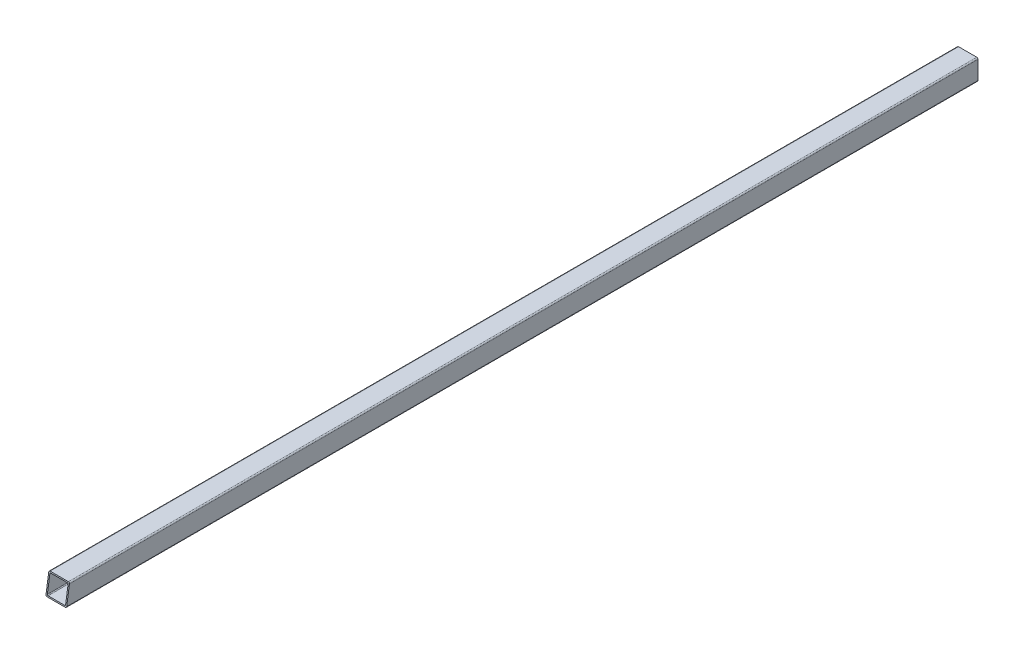
ISO-10303-21;
HEADER;
FILE_DESCRIPTION(('STEP AP214'),'2;1');
FILE_NAME('part.step','',(''),(''),'','','');
FILE_SCHEMA(('AUTOMOTIVE_DESIGN { 1 0 10303 214 1 1 1 1 }'));
ENDSEC;
DATA;
#1=APPLICATION_CONTEXT('core data for automotive mechanical design processes');
#2=APPLICATION_PROTOCOL_DEFINITION('international standard','automotive_design',2000,#1);
#3=PRODUCT_CONTEXT('',#1,'mechanical');
#4=PRODUCT('Part','Part','',(#3));
#5=PRODUCT_RELATED_PRODUCT_CATEGORY('part','',(#4));
#6=PRODUCT_DEFINITION_FORMATION('','',#4);
#7=PRODUCT_DEFINITION_CONTEXT('part definition',#1,'design');
#8=PRODUCT_DEFINITION('design','',#6,#7);
#9=PRODUCT_DEFINITION_SHAPE('','',#8);
#10=(LENGTH_UNIT() NAMED_UNIT(*) SI_UNIT(.MILLI.,.METRE.));
#11=(NAMED_UNIT(*) PLANE_ANGLE_UNIT() SI_UNIT($,.RADIAN.));
#12=(NAMED_UNIT(*) SI_UNIT($,.STERADIAN.) SOLID_ANGLE_UNIT());
#13=UNCERTAINTY_MEASURE_WITH_UNIT(LENGTH_MEASURE(1.E-05),#10,'distance_accuracy_value','');
#14=(GEOMETRIC_REPRESENTATION_CONTEXT(3) GLOBAL_UNCERTAINTY_ASSIGNED_CONTEXT((#13)) GLOBAL_UNIT_ASSIGNED_CONTEXT((#10,
#11,#12)) REPRESENTATION_CONTEXT('',''));
#15=CARTESIAN_POINT('',(0.,0.,0.));
#16=DIRECTION('',(0.,0.,1.));
#17=DIRECTION('',(1.,0.,0.));
#18=AXIS2_PLACEMENT_3D('',#15,#16,#17);
#19=CARTESIAN_POINT('',(5056.,5.99999999999817,100.000000000001));
#20=DIRECTION('',(0.,0.,1.));
#21=DIRECTION('',(1.,0.,0.));
#22=AXIS2_PLACEMENT_3D('',#19,#20,#21);
#23=PLANE('',#22);
#24=CARTESIAN_POINT('',(5056.,5.99999999999817,100.000000000001));
#25=DIRECTION('',(0.,0.,1.));
#26=DIRECTION('',(1.,0.,0.));
#27=AXIS2_PLACEMENT_3D('',#24,#25,#26);
#28=CIRCLE('',#27,6.00000000000014);
#29=CARTESIAN_POINT('',(5050.,5.99999999999817,100.000000000001));
#30=VERTEX_POINT('',#29);
#31=CARTESIAN_POINT('',(5056.,-1.88737914186277E-12,100.000000000001));
#32=VERTEX_POINT('',#31);
#33=EDGE_CURVE('E185',#30,#32,#28,.T.);
#34=ORIENTED_EDGE('',*,*,#33,.F.);
#35=DIRECTION('',(0.,-1.,0.));
#36=VECTOR('',#35,1.);
#37=CARTESIAN_POINT('',(5050.,93.9999999999981,100.000000000001));
#38=LINE('',#37,#36);
#39=CARTESIAN_POINT('',(5050.,93.9999999999981,100.000000000001));
#40=VERTEX_POINT('',#39);
#41=EDGE_CURVE('E139',#40,#30,#38,.T.);
#42=ORIENTED_EDGE('',*,*,#41,.F.);
#43=CARTESIAN_POINT('',(5056.,93.9999999999981,100.000000000001));
#44=DIRECTION('',(0.,0.,1.));
#45=DIRECTION('',(1.,0.,0.));
#46=AXIS2_PLACEMENT_3D('',#43,#44,#45);
#47=CIRCLE('',#46,6.00000000000014);
#48=CARTESIAN_POINT('',(5056.,99.9999999999983,100.000000000001));
#49=VERTEX_POINT('',#48);
#50=EDGE_CURVE('E179',#49,#40,#47,.T.);
#51=ORIENTED_EDGE('',*,*,#50,.F.);
#52=DIRECTION('',(-1.,0.,0.));
#53=VECTOR('',#52,1.);
#54=CARTESIAN_POINT('',(5056.,99.9999999999982,100.000000000001));
#55=LINE('',#54,#53);
#56=CARTESIAN_POINT('',(5144.,99.9999999999982,100.000000000001));
#57=VERTEX_POINT('',#56);
#58=EDGE_CURVE('E175',#57,#49,#55,.T.);
#59=ORIENTED_EDGE('',*,*,#58,.F.);
#60=CARTESIAN_POINT('',(5144.,93.9999999999981,100.000000000001));
#61=DIRECTION('',(0.,0.,1.));
#62=DIRECTION('',(-1.,0.,0.));
#63=AXIS2_PLACEMENT_3D('',#60,#61,#62);
#64=CIRCLE('',#63,6.00000000000014);
#65=CARTESIAN_POINT('',(5150.,93.9999999999981,100.000000000001));
#66=VERTEX_POINT('',#65);
#67=EDGE_CURVE('E171',#66,#57,#64,.T.);
#68=ORIENTED_EDGE('',*,*,#67,.F.);
#69=DIRECTION('',(0.,1.,0.));
#70=VECTOR('',#69,1.);
#71=CARTESIAN_POINT('',(5150.,93.9999999999981,100.000000000001));
#72=LINE('',#71,#70);
#73=CARTESIAN_POINT('',(5150.,5.99999999999817,100.000000000001));
#74=VERTEX_POINT('',#73);
#75=EDGE_CURVE('E167',#74,#66,#72,.T.);
#76=ORIENTED_EDGE('',*,*,#75,.F.);
#77=CARTESIAN_POINT('',(5144.,5.99999999999817,100.000000000001));
#78=DIRECTION('',(0.,0.,1.));
#79=DIRECTION('',(1.,0.,0.));
#80=AXIS2_PLACEMENT_3D('',#77,#78,#79);
#81=CIRCLE('',#80,6.00000000000014);
#82=CARTESIAN_POINT('',(5144.,-1.97064586870965E-12,100.000000000001));
#83=VERTEX_POINT('',#82);
#84=EDGE_CURVE('E163',#83,#74,#81,.T.);
#85=ORIENTED_EDGE('',*,*,#84,.F.);
#86=DIRECTION('',(1.,0.,0.));
#87=VECTOR('',#86,1.);
#88=CARTESIAN_POINT('',(5056.,-1.88737914186277E-12,100.000000000001));
#89=LINE('',#88,#87);
#90=EDGE_CURVE('E159',#32,#83,#89,.T.);
#91=ORIENTED_EDGE('',*,*,#90,.F.);
#92=EDGE_LOOP('',(#34,#42,#51,#59,#68,#76,#85,#91));
#93=FACE_BOUND('',#92,.T.);
#94=CARTESIAN_POINT('',(5060.,9.99999999999818,100.000000000001));
#95=DIRECTION('',(0.,0.,1.));
#96=DIRECTION('',(1.,0.,0.));
#97=AXIS2_PLACEMENT_3D('',#94,#95,#96);
#98=CIRCLE('',#97,3.99999999999978);
#99=CARTESIAN_POINT('',(5056.,9.99999999999818,100.000000000001));
#100=VERTEX_POINT('',#99);
#101=CARTESIAN_POINT('',(5060.,5.99999999999817,100.000000000001));
#102=VERTEX_POINT('',#101);
#103=EDGE_CURVE('E135',#100,#102,#98,.T.);
#104=ORIENTED_EDGE('',*,*,#103,.T.);
#105=DIRECTION('',(1.,0.,0.));
#106=VECTOR('',#105,1.);
#107=CARTESIAN_POINT('',(5060.,5.99999999999817,100.000000000001));
#108=LINE('',#107,#106);
#109=CARTESIAN_POINT('',(5140.,5.9999999999984,100.000000000001));
#110=VERTEX_POINT('',#109);
#111=EDGE_CURVE('E142',#102,#110,#108,.T.);
#112=ORIENTED_EDGE('',*,*,#111,.T.);
#113=CARTESIAN_POINT('',(5140.,9.99999999999818,100.000000000001));
#114=DIRECTION('',(0.,0.,1.));
#115=DIRECTION('',(1.,0.,0.));
#116=AXIS2_PLACEMENT_3D('',#113,#114,#115);
#117=CIRCLE('',#116,3.99999999999978);
#118=CARTESIAN_POINT('',(5144.,9.99999999999818,100.000000000001));
#119=VERTEX_POINT('',#118);
#120=EDGE_CURVE('E146',#110,#119,#117,.T.);
#121=ORIENTED_EDGE('',*,*,#120,.T.);
#122=DIRECTION('',(0.,1.,0.));
#123=VECTOR('',#122,1.);
#124=CARTESIAN_POINT('',(5144.,89.9999999999981,100.000000000001));
#125=LINE('',#124,#123);
#126=CARTESIAN_POINT('',(5144.,89.9999999999981,100.000000000001));
#127=VERTEX_POINT('',#126);
#128=EDGE_CURVE('E251',#119,#127,#125,.T.);
#129=ORIENTED_EDGE('',*,*,#128,.T.);
#130=CARTESIAN_POINT('',(5140.,89.9999999999981,100.000000000001));
#131=DIRECTION('',(0.,0.,1.));
#132=DIRECTION('',(-1.,0.,0.));
#133=AXIS2_PLACEMENT_3D('',#130,#131,#132);
#134=CIRCLE('',#133,3.99999999999978);
#135=CARTESIAN_POINT('',(5140.,93.9999999999981,100.000000000001));
#136=VERTEX_POINT('',#135);
#137=EDGE_CURVE('E249',#127,#136,#134,.T.);
#138=ORIENTED_EDGE('',*,*,#137,.T.);
#139=DIRECTION('',(-1.,0.,0.));
#140=VECTOR('',#139,1.);
#141=CARTESIAN_POINT('',(5060.,93.9999999999981,100.000000000001));
#142=LINE('',#141,#140);
#143=CARTESIAN_POINT('',(5060.,93.9999999999979,100.000000000001));
#144=VERTEX_POINT('',#143);
#145=EDGE_CURVE('E244',#136,#144,#142,.T.);
#146=ORIENTED_EDGE('',*,*,#145,.T.);
#147=CARTESIAN_POINT('',(5060.,89.9999999999981,100.000000000001));
#148=DIRECTION('',(0.,0.,1.));
#149=DIRECTION('',(1.,0.,0.));
#150=AXIS2_PLACEMENT_3D('',#147,#148,#149);
#151=CIRCLE('',#150,3.99999999999978);
#152=CARTESIAN_POINT('',(5056.,89.9999999999981,100.000000000001));
#153=VERTEX_POINT('',#152);
#154=EDGE_CURVE('E242',#144,#153,#151,.T.);
#155=ORIENTED_EDGE('',*,*,#154,.T.);
#156=DIRECTION('',(0.,-1.,0.));
#157=VECTOR('',#156,1.);
#158=CARTESIAN_POINT('',(5056.,89.9999999999981,100.000000000001));
#159=LINE('',#158,#157);
#160=EDGE_CURVE('E150',#153,#100,#159,.T.);
#161=ORIENTED_EDGE('',*,*,#160,.T.);
#162=EDGE_LOOP('',(#104,#112,#121,#129,#138,#146,#155,#161));
#163=FACE_BOUND('',#162,.T.);
#164=ADVANCED_FACE('F44',(#93,#163),#23,.F.);
#165=CARTESIAN_POINT('',(5056.,5.99999999999817,4633.66704519014));
#166=DIRECTION('',(0.,0.,-1.));
#167=DIRECTION('',(-1.,0.,0.));
#168=AXIS2_PLACEMENT_3D('',#165,#166,#167);
#169=CYLINDRICAL_SURFACE('',#168,6.00000000000014);
#170=DIRECTION('',(0.,0.,-1.));
#171=VECTOR('',#170,1.);
#172=CARTESIAN_POINT('',(5056.,-1.88737914186277E-12,4633.66704519014));
#173=LINE('',#172,#171);
#174=CARTESIAN_POINT('',(5056.,-1.88737914186277E-12,4498.90120148865));
#175=VERTEX_POINT('',#174);
#176=EDGE_CURVE('E157',#175,#32,#173,.T.);
#177=ORIENTED_EDGE('',*,*,#176,.F.);
#178=CARTESIAN_POINT('',(5056.,5.99999999999817,4498.00930383893));
#179=DIRECTION('',(0.,-0.147034000874356,-0.989131438478668));
#180=DIRECTION('',(0.,0.989131438478668,-0.147034000874356));
#181=AXIS2_PLACEMENT_3D('',#178,#179,#180);
#182=ELLIPSE('',#181,6.06592791068135,6.00000000000014);
#183=CARTESIAN_POINT('',(5050.,5.99999999999816,4498.00930383892));
#184=VERTEX_POINT('',#183);
#185=EDGE_CURVE('E63',#175,#184,#182,.T.);
#186=ORIENTED_EDGE('',*,*,#185,.T.);
#187=DIRECTION('',(0.,0.,-1.));
#188=VECTOR('',#187,1.);
#189=CARTESIAN_POINT('',(5050.,5.99999999999817,4633.66704519014));
#190=LINE('',#189,#188);
#191=EDGE_CURVE('E184',#184,#30,#190,.T.);
#192=ORIENTED_EDGE('',*,*,#191,.T.);
#193=ORIENTED_EDGE('',*,*,#33,.T.);
#194=EDGE_LOOP('',(#177,#186,#192,#193));
#195=FACE_BOUND('',#194,.T.);
#196=ADVANCED_FACE('F320',(#195),#169,.T.);
#197=CARTESIAN_POINT('',(5056.,-1.88737914186277E-12,4633.66704519014));
#198=DIRECTION('',(0.,1.,0.));
#199=DIRECTION('',(0.,0.,1.));
#200=AXIS2_PLACEMENT_3D('',#197,#198,#199);
#201=PLANE('',#200);
#202=DIRECTION('',(0.,0.,-1.));
#203=VECTOR('',#202,1.);
#204=CARTESIAN_POINT('',(5144.,-1.97064586870965E-12,4633.66704519014));
#205=LINE('',#204,#203);
#206=CARTESIAN_POINT('',(5144.,-1.97064586870965E-12,4498.90120148865));
#207=VERTEX_POINT('',#206);
#208=EDGE_CURVE('E161',#207,#83,#205,.T.);
#209=ORIENTED_EDGE('',*,*,#208,.F.);
#210=DIRECTION('',(-1.,0.,0.));
#211=VECTOR('',#210,1.);
#212=CARTESIAN_POINT('',(5056.,-1.88737914186277E-12,4498.90120148865));
#213=LINE('',#212,#211);
#214=EDGE_CURVE('E160',#207,#175,#213,.T.);
#215=ORIENTED_EDGE('',*,*,#214,.T.);
#216=ORIENTED_EDGE('',*,*,#176,.T.);
#217=ORIENTED_EDGE('',*,*,#90,.T.);
#218=EDGE_LOOP('',(#209,#215,#216,#217));
#219=FACE_BOUND('',#218,.T.);
#220=ADVANCED_FACE('F291',(#219),#201,.F.);
#221=CARTESIAN_POINT('',(5144.,5.99999999999817,4633.66704519014));
#222=DIRECTION('',(0.,0.,-1.));
#223=DIRECTION('',(-1.,0.,0.));
#224=AXIS2_PLACEMENT_3D('',#221,#222,#223);
#225=CYLINDRICAL_SURFACE('',#224,6.00000000000014);
#226=DIRECTION('',(0.,0.,-1.));
#227=VECTOR('',#226,1.);
#228=CARTESIAN_POINT('',(5150.,5.99999999999817,4633.66704519014));
#229=LINE('',#228,#227);
#230=CARTESIAN_POINT('',(5150.,5.99999999999816,4498.00930383892));
#231=VERTEX_POINT('',#230);
#232=EDGE_CURVE('E165',#231,#74,#229,.T.);
#233=ORIENTED_EDGE('',*,*,#232,.F.);
#234=CARTESIAN_POINT('',(5144.,5.99999999999817,4498.00930383893));
#235=DIRECTION('',(0.,-0.147034000874356,-0.989131438478668));
#236=DIRECTION('',(0.,0.989131438478668,-0.147034000874356));
#237=AXIS2_PLACEMENT_3D('',#234,#235,#236);
#238=ELLIPSE('',#237,6.06592791068135,6.00000000000014);
#239=EDGE_CURVE('E164',#231,#207,#238,.T.);
#240=ORIENTED_EDGE('',*,*,#239,.T.);
#241=ORIENTED_EDGE('',*,*,#208,.T.);
#242=ORIENTED_EDGE('',*,*,#84,.T.);
#243=EDGE_LOOP('',(#233,#240,#241,#242));
#244=FACE_BOUND('',#243,.T.);
#245=ADVANCED_FACE('F296',(#244),#225,.T.);
#246=CARTESIAN_POINT('',(5150.,93.9999999999981,4633.66704519014));
#247=DIRECTION('',(-1.,0.,0.));
#248=DIRECTION('',(0.,0.,1.));
#249=AXIS2_PLACEMENT_3D('',#246,#247,#248);
#250=PLANE('',#249);
#251=DIRECTION('',(0.,0.,-1.));
#252=VECTOR('',#251,1.);
#253=CARTESIAN_POINT('',(5150.,93.9999999999981,4633.66704519014));
#254=LINE('',#253,#252);
#255=CARTESIAN_POINT('',(5150.,93.9999999999981,4484.92813830966));
#256=VERTEX_POINT('',#255);
#257=EDGE_CURVE('E169',#256,#66,#254,.T.);
#258=ORIENTED_EDGE('',*,*,#257,.F.);
#259=DIRECTION('',(0.,-0.989131438478668,0.147034000874356));
#260=VECTOR('',#259,1.);
#261=CARTESIAN_POINT('',(5150.,72.3680153608737,4488.14372435274));
#262=LINE('',#261,#260);
#263=EDGE_CURVE('E168',#256,#231,#262,.T.);
#264=ORIENTED_EDGE('',*,*,#263,.T.);
#265=ORIENTED_EDGE('',*,*,#232,.T.);
#266=ORIENTED_EDGE('',*,*,#75,.T.);
#267=EDGE_LOOP('',(#258,#264,#265,#266));
#268=FACE_BOUND('',#267,.T.);
#269=ADVANCED_FACE('F301',(#268),#250,.F.);
#270=CARTESIAN_POINT('',(5144.,93.9999999999981,4633.66704519014));
#271=DIRECTION('',(0.,0.,-1.));
#272=DIRECTION('',(-1.,0.,0.));
#273=AXIS2_PLACEMENT_3D('',#270,#271,#272);
#274=CYLINDRICAL_SURFACE('',#273,6.00000000000014);
#275=DIRECTION('',(0.,0.,-1.));
#276=VECTOR('',#275,1.);
#277=CARTESIAN_POINT('',(5144.,99.9999999999982,4633.66704519014));
#278=LINE('',#277,#276);
#279=CARTESIAN_POINT('',(5144.,99.9999999999982,4484.03624065993));
#280=VERTEX_POINT('',#279);
#281=EDGE_CURVE('E173',#280,#57,#278,.T.);
#282=ORIENTED_EDGE('',*,*,#281,.F.);
#283=CARTESIAN_POINT('',(5144.,93.9999999999981,4484.92813830966));
#284=DIRECTION('',(0.,-0.147034000874356,-0.989131438478668));
#285=DIRECTION('',(0.,0.989131438478668,-0.147034000874356));
#286=AXIS2_PLACEMENT_3D('',#283,#284,#285);
#287=ELLIPSE('',#286,6.06592791068135,6.00000000000014);
#288=EDGE_CURVE('E172',#280,#256,#287,.T.);
#289=ORIENTED_EDGE('',*,*,#288,.T.);
#290=ORIENTED_EDGE('',*,*,#257,.T.);
#291=ORIENTED_EDGE('',*,*,#67,.T.);
#292=EDGE_LOOP('',(#282,#289,#290,#291));
#293=FACE_BOUND('',#292,.T.);
#294=ADVANCED_FACE('F306',(#293),#274,.T.);
#295=CARTESIAN_POINT('',(5056.,99.9999999999982,4633.66704519014));
#296=DIRECTION('',(0.,-1.,0.));
#297=DIRECTION('',(0.,0.,-1.));
#298=AXIS2_PLACEMENT_3D('',#295,#296,#297);
#299=PLANE('',#298);
#300=DIRECTION('',(0.,0.,-1.));
#301=VECTOR('',#300,1.);
#302=CARTESIAN_POINT('',(5056.,99.9999999999983,4633.66704519014));
#303=LINE('',#302,#301);
#304=CARTESIAN_POINT('',(5056.,99.9999999999983,4484.03624065993));
#305=VERTEX_POINT('',#304);
#306=EDGE_CURVE('E177',#305,#49,#303,.T.);
#307=ORIENTED_EDGE('',*,*,#306,.F.);
#308=DIRECTION('',(1.,0.,0.));
#309=VECTOR('',#308,1.);
#310=CARTESIAN_POINT('',(5056.,99.9999999999982,4484.03624065993));
#311=LINE('',#310,#309);
#312=EDGE_CURVE('E176',#305,#280,#311,.T.);
#313=ORIENTED_EDGE('',*,*,#312,.T.);
#314=ORIENTED_EDGE('',*,*,#281,.T.);
#315=ORIENTED_EDGE('',*,*,#58,.T.);
#316=EDGE_LOOP('',(#307,#313,#314,#315));
#317=FACE_BOUND('',#316,.T.);
#318=ADVANCED_FACE('F311',(#317),#299,.F.);
#319=CARTESIAN_POINT('',(5056.,93.9999999999981,4633.66704519014));
#320=DIRECTION('',(0.,0.,-1.));
#321=DIRECTION('',(-1.,0.,0.));
#322=AXIS2_PLACEMENT_3D('',#319,#320,#321);
#323=CYLINDRICAL_SURFACE('',#322,6.00000000000014);
#324=DIRECTION('',(0.,0.,-1.));
#325=VECTOR('',#324,1.);
#326=CARTESIAN_POINT('',(5050.,93.9999999999981,4633.66704519014));
#327=LINE('',#326,#325);
#328=CARTESIAN_POINT('',(5050.,93.9999999999982,4484.92813830965));
#329=VERTEX_POINT('',#328);
#330=EDGE_CURVE('E181',#329,#40,#327,.T.);
#331=ORIENTED_EDGE('',*,*,#330,.F.);
#332=CARTESIAN_POINT('',(5056.,93.9999999999981,4484.92813830966));
#333=DIRECTION('',(0.,-0.147034000874356,-0.989131438478668));
#334=DIRECTION('',(0.,0.989131438478668,-0.147034000874356));
#335=AXIS2_PLACEMENT_3D('',#332,#333,#334);
#336=ELLIPSE('',#335,6.06592791068135,6.00000000000014);
#337=EDGE_CURVE('E180',#329,#305,#336,.T.);
#338=ORIENTED_EDGE('',*,*,#337,.T.);
#339=ORIENTED_EDGE('',*,*,#306,.T.);
#340=ORIENTED_EDGE('',*,*,#50,.T.);
#341=EDGE_LOOP('',(#331,#338,#339,#340));
#342=FACE_BOUND('',#341,.T.);
#343=ADVANCED_FACE('F316',(#342),#323,.T.);
#344=CARTESIAN_POINT('',(5050.,93.9999999999981,4633.66704519014));
#345=DIRECTION('',(1.,0.,0.));
#346=DIRECTION('',(0.,0.,-1.));
#347=AXIS2_PLACEMENT_3D('',#344,#345,#346);
#348=PLANE('',#347);
#349=ORIENTED_EDGE('',*,*,#191,.F.);
#350=DIRECTION('',(0.,0.989131438478668,-0.147034000874356));
#351=VECTOR('',#350,1.);
#352=CARTESIAN_POINT('',(5050.,72.3680153608737,4488.14372435274));
#353=LINE('',#352,#351);
#354=EDGE_CURVE('E183',#184,#329,#353,.T.);
#355=ORIENTED_EDGE('',*,*,#354,.T.);
#356=ORIENTED_EDGE('',*,*,#330,.T.);
#357=ORIENTED_EDGE('',*,*,#41,.T.);
#358=EDGE_LOOP('',(#349,#355,#356,#357));
#359=FACE_BOUND('',#358,.T.);
#360=ADVANCED_FACE('F323',(#359),#348,.F.);
#361=CARTESIAN_POINT('',(5060.,9.99999999999818,4633.66704519014));
#362=DIRECTION('',(0.,0.,-1.));
#363=DIRECTION('',(-1.,0.,0.));
#364=AXIS2_PLACEMENT_3D('',#361,#362,#363);
#365=CYLINDRICAL_SURFACE('',#364,3.99999999999978);
#366=CARTESIAN_POINT('',(5060.,9.99999999999818,4497.41470540578));
#367=DIRECTION('',(0.,-0.147034000874356,-0.989131438478668));
#368=DIRECTION('',(0.,0.989131438478668,-0.147034000874356));
#369=AXIS2_PLACEMENT_3D('',#366,#367,#368);
#370=ELLIPSE('',#369,4.04395194045391,3.99999999999978);
#371=CARTESIAN_POINT('',(5060.,5.99999999999817,4498.00930383893));
#372=VERTEX_POINT('',#371);
#373=CARTESIAN_POINT('',(5056.,9.99999999999815,4497.41470540578));
#374=VERTEX_POINT('',#373);
#375=EDGE_CURVE('E138',#372,#374,#370,.T.);
#376=ORIENTED_EDGE('',*,*,#375,.F.);
#377=DIRECTION('',(0.,0.,-1.));
#378=VECTOR('',#377,1.);
#379=CARTESIAN_POINT('',(5060.,5.99999999999817,4633.66704519014));
#380=LINE('',#379,#378);
#381=EDGE_CURVE('E131',#372,#102,#380,.T.);
#382=ORIENTED_EDGE('',*,*,#381,.T.);
#383=ORIENTED_EDGE('',*,*,#103,.F.);
#384=DIRECTION('',(0.,0.,-1.));
#385=VECTOR('',#384,1.);
#386=CARTESIAN_POINT('',(5056.,9.99999999999818,4633.66704519014));
#387=LINE('',#386,#385);
#388=EDGE_CURVE('E198',#374,#100,#387,.T.);
#389=ORIENTED_EDGE('',*,*,#388,.F.);
#390=EDGE_LOOP('',(#376,#382,#383,#389));
#391=FACE_BOUND('',#390,.T.);
#392=ADVANCED_FACE('F132',(#391),#365,.F.);
#393=CARTESIAN_POINT('',(5060.,5.99999999999817,4633.66704519014));
#394=DIRECTION('',(0.,1.,0.));
#395=DIRECTION('',(0.,0.,1.));
#396=AXIS2_PLACEMENT_3D('',#393,#394,#395);
#397=PLANE('',#396);
#398=DIRECTION('',(-1.,0.,0.));
#399=VECTOR('',#398,1.);
#400=CARTESIAN_POINT('',(5060.,5.99999999999817,4498.00930383893));
#401=LINE('',#400,#399);
#402=CARTESIAN_POINT('',(5140.,5.9999999999984,4498.00930383893));
#403=VERTEX_POINT('',#402);
#404=EDGE_CURVE('E13',#403,#372,#401,.T.);
#405=ORIENTED_EDGE('',*,*,#404,.F.);
#406=DIRECTION('',(0.,0.,-1.));
#407=VECTOR('',#406,1.);
#408=CARTESIAN_POINT('',(5140.,5.9999999999984,4633.66704519014));
#409=LINE('',#408,#407);
#410=EDGE_CURVE('E124',#403,#110,#409,.T.);
#411=ORIENTED_EDGE('',*,*,#410,.T.);
#412=ORIENTED_EDGE('',*,*,#111,.F.);
#413=ORIENTED_EDGE('',*,*,#381,.F.);
#414=EDGE_LOOP('',(#405,#411,#412,#413));
#415=FACE_BOUND('',#414,.T.);
#416=ADVANCED_FACE('F143',(#415),#397,.T.);
#417=CARTESIAN_POINT('',(5140.,9.99999999999818,4633.66704519014));
#418=DIRECTION('',(0.,0.,-1.));
#419=DIRECTION('',(-1.,0.,0.));
#420=AXIS2_PLACEMENT_3D('',#417,#418,#419);
#421=CYLINDRICAL_SURFACE('',#420,3.99999999999978);
#422=CARTESIAN_POINT('',(5140.,9.99999999999818,4497.41470540578));
#423=DIRECTION('',(0.,-0.147034000874356,-0.989131438478668));
#424=DIRECTION('',(0.,0.989131438478668,-0.147034000874356));
#425=AXIS2_PLACEMENT_3D('',#422,#423,#424);
#426=ELLIPSE('',#425,4.04395194045391,3.99999999999978);
#427=CARTESIAN_POINT('',(5144.,9.99999999999818,4497.41470540578));
#428=VERTEX_POINT('',#427);
#429=EDGE_CURVE('E54',#428,#403,#426,.T.);
#430=ORIENTED_EDGE('',*,*,#429,.F.);
#431=DIRECTION('',(0.,0.,-1.));
#432=VECTOR('',#431,1.);
#433=CARTESIAN_POINT('',(5144.,9.99999999999818,4633.66704519014));
#434=LINE('',#433,#432);
#435=EDGE_CURVE('E188',#428,#119,#434,.T.);
#436=ORIENTED_EDGE('',*,*,#435,.T.);
#437=ORIENTED_EDGE('',*,*,#120,.F.);
#438=ORIENTED_EDGE('',*,*,#410,.F.);
#439=EDGE_LOOP('',(#430,#436,#437,#438));
#440=FACE_BOUND('',#439,.T.);
#441=ADVANCED_FACE('F258',(#440),#421,.F.);
#442=CARTESIAN_POINT('',(5144.,89.9999999999981,4633.66704519014));
#443=DIRECTION('',(-1.,0.,0.));
#444=DIRECTION('',(0.,0.,1.));
#445=AXIS2_PLACEMENT_3D('',#442,#443,#444);
#446=PLANE('',#445);
#447=DIRECTION('',(0.,-0.989131438478668,0.147034000874356));
#448=VECTOR('',#447,1.);
#449=CARTESIAN_POINT('',(5144.,68.4544913505262,4488.7254681639));
#450=LINE('',#449,#448);
#451=CARTESIAN_POINT('',(5144.,89.9999999999981,4485.52273674281));
#452=VERTEX_POINT('',#451);
#453=EDGE_CURVE('E218',#452,#428,#450,.T.);
#454=ORIENTED_EDGE('',*,*,#453,.F.);
#455=DIRECTION('',(0.,0.,-1.));
#456=VECTOR('',#455,1.);
#457=CARTESIAN_POINT('',(5144.,89.9999999999981,4633.66704519014));
#458=LINE('',#457,#456);
#459=EDGE_CURVE('E190',#452,#127,#458,.T.);
#460=ORIENTED_EDGE('',*,*,#459,.T.);
#461=ORIENTED_EDGE('',*,*,#128,.F.);
#462=ORIENTED_EDGE('',*,*,#435,.F.);
#463=EDGE_LOOP('',(#454,#460,#461,#462));
#464=FACE_BOUND('',#463,.T.);
#465=ADVANCED_FACE('F264',(#464),#446,.T.);
#466=CARTESIAN_POINT('',(5140.,89.9999999999981,4633.66704519014));
#467=DIRECTION('',(0.,0.,-1.));
#468=DIRECTION('',(-1.,0.,0.));
#469=AXIS2_PLACEMENT_3D('',#466,#467,#468);
#470=CYLINDRICAL_SURFACE('',#469,3.99999999999978);
#471=CARTESIAN_POINT('',(5140.,89.9999999999981,4485.52273674281));
#472=DIRECTION('',(0.,-0.147034000874356,-0.989131438478668));
#473=DIRECTION('',(0.,0.989131438478668,-0.147034000874356));
#474=AXIS2_PLACEMENT_3D('',#471,#472,#473);
#475=ELLIPSE('',#474,4.04395194045391,3.99999999999978);
#476=CARTESIAN_POINT('',(5140.,93.9999999999981,4484.92813830966));
#477=VERTEX_POINT('',#476);
#478=EDGE_CURVE('E221',#477,#452,#475,.T.);
#479=ORIENTED_EDGE('',*,*,#478,.F.);
#480=DIRECTION('',(0.,0.,-1.));
#481=VECTOR('',#480,1.);
#482=CARTESIAN_POINT('',(5140.,93.9999999999981,4633.66704519014));
#483=LINE('',#482,#481);
#484=EDGE_CURVE('E192',#477,#136,#483,.T.);
#485=ORIENTED_EDGE('',*,*,#484,.T.);
#486=ORIENTED_EDGE('',*,*,#137,.F.);
#487=ORIENTED_EDGE('',*,*,#459,.F.);
#488=EDGE_LOOP('',(#479,#485,#486,#487));
#489=FACE_BOUND('',#488,.T.);
#490=ADVANCED_FACE('F268',(#489),#470,.F.);
#491=CARTESIAN_POINT('',(5060.,93.9999999999981,4633.66704519014));
#492=DIRECTION('',(0.,-1.,0.));
#493=DIRECTION('',(0.,0.,-1.));
#494=AXIS2_PLACEMENT_3D('',#491,#492,#493);
#495=PLANE('',#494);
#496=DIRECTION('',(1.,0.,0.));
#497=VECTOR('',#496,1.);
#498=CARTESIAN_POINT('',(5060.,93.9999999999981,4484.92813830966));
#499=LINE('',#498,#497);
#500=CARTESIAN_POINT('',(5060.,93.9999999999979,4484.92813830966));
#501=VERTEX_POINT('',#500);
#502=EDGE_CURVE('E223',#501,#477,#499,.T.);
#503=ORIENTED_EDGE('',*,*,#502,.F.);
#504=DIRECTION('',(0.,0.,-1.));
#505=VECTOR('',#504,1.);
#506=CARTESIAN_POINT('',(5060.,93.9999999999979,4633.66704519014));
#507=LINE('',#506,#505);
#508=EDGE_CURVE('E194',#501,#144,#507,.T.);
#509=ORIENTED_EDGE('',*,*,#508,.T.);
#510=ORIENTED_EDGE('',*,*,#145,.F.);
#511=ORIENTED_EDGE('',*,*,#484,.F.);
#512=EDGE_LOOP('',(#503,#509,#510,#511));
#513=FACE_BOUND('',#512,.T.);
#514=ADVANCED_FACE('F238',(#513),#495,.T.);
#515=CARTESIAN_POINT('',(5060.,89.9999999999981,4633.66704519014));
#516=DIRECTION('',(0.,0.,-1.));
#517=DIRECTION('',(-1.,0.,0.));
#518=AXIS2_PLACEMENT_3D('',#515,#516,#517);
#519=CYLINDRICAL_SURFACE('',#518,3.99999999999978);
#520=CARTESIAN_POINT('',(5060.,89.9999999999981,4485.52273674281));
#521=DIRECTION('',(0.,-0.147034000874356,-0.989131438478668));
#522=DIRECTION('',(0.,0.989131438478668,-0.147034000874356));
#523=AXIS2_PLACEMENT_3D('',#520,#521,#522);
#524=ELLIPSE('',#523,4.04395194045391,3.99999999999978);
#525=CARTESIAN_POINT('',(5056.,89.9999999999981,4485.5227367428));
#526=VERTEX_POINT('',#525);
#527=EDGE_CURVE('E48',#526,#501,#524,.T.);
#528=ORIENTED_EDGE('',*,*,#527,.F.);
#529=DIRECTION('',(0.,0.,-1.));
#530=VECTOR('',#529,1.);
#531=CARTESIAN_POINT('',(5056.,89.9999999999981,4633.66704519014));
#532=LINE('',#531,#530);
#533=EDGE_CURVE('E196',#526,#153,#532,.T.);
#534=ORIENTED_EDGE('',*,*,#533,.T.);
#535=ORIENTED_EDGE('',*,*,#154,.F.);
#536=ORIENTED_EDGE('',*,*,#508,.F.);
#537=EDGE_LOOP('',(#528,#534,#535,#536));
#538=FACE_BOUND('',#537,.T.);
#539=ADVANCED_FACE('F241',(#538),#519,.F.);
#540=CARTESIAN_POINT('',(5056.,89.9999999999981,4633.66704519014));
#541=DIRECTION('',(1.,0.,0.));
#542=DIRECTION('',(0.,0.,-1.));
#543=AXIS2_PLACEMENT_3D('',#540,#541,#542);
#544=PLANE('',#543);
#545=DIRECTION('',(0.,0.989131438478668,-0.147034000874356));
#546=VECTOR('',#545,1.);
#547=CARTESIAN_POINT('',(5056.,68.4544913505262,4488.7254681639));
#548=LINE('',#547,#546);
#549=EDGE_CURVE('E154',#374,#526,#548,.T.);
#550=ORIENTED_EDGE('',*,*,#549,.F.);
#551=ORIENTED_EDGE('',*,*,#388,.T.);
#552=ORIENTED_EDGE('',*,*,#160,.F.);
#553=ORIENTED_EDGE('',*,*,#533,.F.);
#554=EDGE_LOOP('',(#550,#551,#552,#553));
#555=FACE_BOUND('',#554,.T.);
#556=ADVANCED_FACE('F356',(#555),#544,.T.);
#557=CARTESIAN_POINT('',(5144.,2593.30113283824,4113.40800392163));
#558=DIRECTION('',(0.,-0.147034000874356,-0.989131438478668));
#559=DIRECTION('',(0.,0.989131438478668,-0.147034000874356));
#560=AXIS2_PLACEMENT_3D('',#557,#558,#559);
#561=PLANE('',#560);
#562=ORIENTED_EDGE('',*,*,#375,.T.);
#563=ORIENTED_EDGE('',*,*,#549,.T.);
#564=ORIENTED_EDGE('',*,*,#527,.T.);
#565=ORIENTED_EDGE('',*,*,#502,.T.);
#566=ORIENTED_EDGE('',*,*,#478,.T.);
#567=ORIENTED_EDGE('',*,*,#453,.T.);
#568=ORIENTED_EDGE('',*,*,#429,.T.);
#569=ORIENTED_EDGE('',*,*,#404,.T.);
#570=EDGE_LOOP('',(#562,#563,#564,#565,#566,#567,#568,#569));
#571=FACE_BOUND('',#570,.T.);
#572=ORIENTED_EDGE('',*,*,#214,.F.);
#573=ORIENTED_EDGE('',*,*,#239,.F.);
#574=ORIENTED_EDGE('',*,*,#263,.F.);
#575=ORIENTED_EDGE('',*,*,#288,.F.);
#576=ORIENTED_EDGE('',*,*,#312,.F.);
#577=ORIENTED_EDGE('',*,*,#337,.F.);
#578=ORIENTED_EDGE('',*,*,#354,.F.);
#579=ORIENTED_EDGE('',*,*,#185,.F.);
#580=EDGE_LOOP('',(#572,#573,#574,#575,#576,#577,#578,#579));
#581=FACE_BOUND('',#580,.T.);
#582=ADVANCED_FACE('F46',(#571,#581),#561,.F.);
#583=CLOSED_SHELL('',(#164,#196,#220,#245,#269,#294,#318,#343,#360,#392,#416,#441,#465,#490,
#514,#539,#556,#582));
#584=MANIFOLD_SOLID_BREP('B2',#583);
#585=ADVANCED_BREP_SHAPE_REPRESENTATION('',(#18,#584),#14);
#586=SHAPE_DEFINITION_REPRESENTATION(#9,#585);
ENDSEC;
END-ISO-10303-21;
